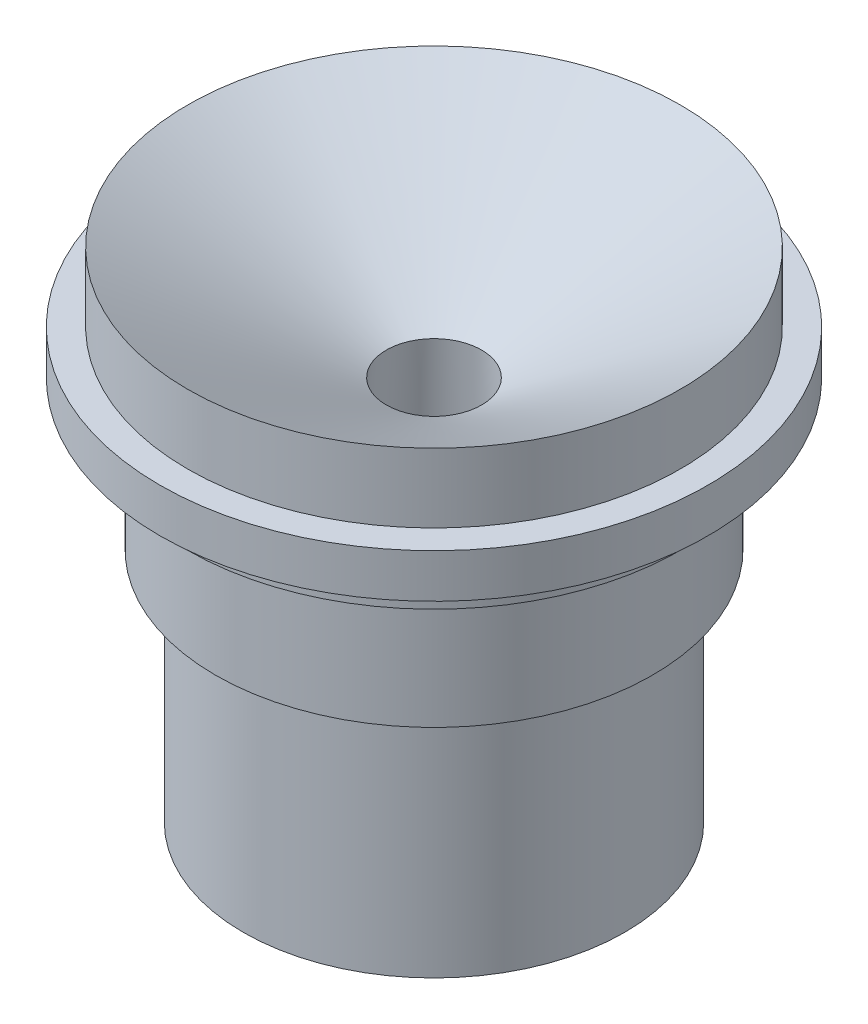
ISO-10303-21;
HEADER;
FILE_DESCRIPTION(('STEP AP214'),'2;1');
FILE_NAME('part.step','',(''),(''),'','','');
FILE_SCHEMA(('AUTOMOTIVE_DESIGN { 1 0 10303 214 1 1 1 1 }'));
ENDSEC;
DATA;
#1=APPLICATION_CONTEXT('core data for automotive mechanical design processes');
#2=APPLICATION_PROTOCOL_DEFINITION('international standard','automotive_design',2000,#1);
#3=PRODUCT_CONTEXT('',#1,'mechanical');
#4=PRODUCT('Part','Part','',(#3));
#5=PRODUCT_RELATED_PRODUCT_CATEGORY('part','',(#4));
#6=PRODUCT_DEFINITION_FORMATION('','',#4);
#7=PRODUCT_DEFINITION_CONTEXT('part definition',#1,'design');
#8=PRODUCT_DEFINITION('design','',#6,#7);
#9=PRODUCT_DEFINITION_SHAPE('','',#8);
#10=(LENGTH_UNIT() NAMED_UNIT(*) SI_UNIT(.MILLI.,.METRE.));
#11=(NAMED_UNIT(*) PLANE_ANGLE_UNIT() SI_UNIT($,.RADIAN.));
#12=(NAMED_UNIT(*) SI_UNIT($,.STERADIAN.) SOLID_ANGLE_UNIT());
#13=UNCERTAINTY_MEASURE_WITH_UNIT(LENGTH_MEASURE(1.E-05),#10,'distance_accuracy_value','');
#14=(GEOMETRIC_REPRESENTATION_CONTEXT(3) GLOBAL_UNCERTAINTY_ASSIGNED_CONTEXT((#13)) GLOBAL_UNIT_ASSIGNED_CONTEXT((#10,
#11,#12)) REPRESENTATION_CONTEXT('',''));
#15=CARTESIAN_POINT('',(0.,0.,0.));
#16=DIRECTION('',(0.,0.,1.));
#17=DIRECTION('',(1.,0.,0.));
#18=AXIS2_PLACEMENT_3D('',#15,#16,#17);
#19=CARTESIAN_POINT('',(0.,69.2545966925437,0.));
#20=DIRECTION('',(0.,1.,0.));
#21=DIRECTION('',(0.,0.,1.));
#22=AXIS2_PLACEMENT_3D('',#19,#20,#21);
#23=CONICAL_SURFACE('',#22,8.56625315211337,1.0539623590716);
#24=CARTESIAN_POINT('',(0.,89.5587412123213,0.));
#25=DIRECTION('',(0.,1.,0.));
#26=DIRECTION('',(0.,0.,1.));
#27=AXIS2_PLACEMENT_3D('',#24,#25,#26);
#28=CIRCLE('',#27,44.29);
#29=CARTESIAN_POINT('',(0.,89.5587412123212,44.29));
#30=VERTEX_POINT('',#29);
#31=EDGE_CURVE('E77',#30,#30,#28,.T.);
#32=CARTESIAN_POINT('',(0.,69.2545966925437,0.));
#33=DIRECTION('',(0.,1.,0.));
#34=DIRECTION('',(0.,0.,1.));
#35=AXIS2_PLACEMENT_3D('',#32,#33,#34);
#36=CIRCLE('',#35,8.56625315211337);
#37=CARTESIAN_POINT('',(0.,69.2545966925437,8.56625315211336));
#38=VERTEX_POINT('',#37);
#39=EDGE_CURVE('E10',#38,#38,#36,.T.);
#40=CARTESIAN_POINT('',(0.,89.5587412123212,44.29));
#41=CARTESIAN_POINT('',(0.,89.3472397069069,43.9178776370012));
#42=CARTESIAN_POINT('',(0.,89.1357382014926,43.5457552740023));
#43=CARTESIAN_POINT('',(0.,88.7127351906638,42.8015105480047));
#44=CARTESIAN_POINT('',(0.,88.5012336852495,42.4293881850059));
#45=CARTESIAN_POINT('',(0.,88.0782306744208,41.6851434590083));
#46=CARTESIAN_POINT('',(0.,87.8667291690064,41.3130210960094));
#47=CARTESIAN_POINT('',(0.,87.4437261581778,40.5687763700118));
#48=CARTESIAN_POINT('',(0.,87.2322246527634,40.196654007013));
#49=CARTESIAN_POINT('',(0.,86.8092216419347,39.4524092810153));
#50=CARTESIAN_POINT('',(0.,86.5977201365204,39.0802869180165));
#51=CARTESIAN_POINT('',(0.,86.1747171256917,38.3360421920189));
#52=CARTESIAN_POINT('',(0.,85.9632156202773,37.9639198290201));
#53=CARTESIAN_POINT('',(0.,85.5402126094486,37.2196751030224));
#54=CARTESIAN_POINT('',(0.,85.3287111040343,36.8475527400236));
#55=CARTESIAN_POINT('',(0.,84.9057080932056,36.103308014026));
#56=CARTESIAN_POINT('',(0.,84.6942065877912,35.7311856510271));
#57=CARTESIAN_POINT('',(0.,84.2712035769625,34.9869409250295));
#58=CARTESIAN_POINT('',(0.,84.0597020715482,34.6148185620307));
#59=CARTESIAN_POINT('',(0.,83.6366990607195,33.8705738360331));
#60=CARTESIAN_POINT('',(0.,83.4251975553051,33.4984514730342));
#61=CARTESIAN_POINT('',(0.,83.0021945444764,32.7542067470366));
#62=CARTESIAN_POINT('',(0.,82.7906930390621,32.3820843840378));
#63=CARTESIAN_POINT('',(0.,82.3676900282334,31.6378396580401));
#64=CARTESIAN_POINT('',(0.,82.156188522819,31.2657172950413));
#65=CARTESIAN_POINT('',(0.,81.7331855119903,30.5214725690437));
#66=CARTESIAN_POINT('',(0.,81.521684006576,30.1493502060449));
#67=CARTESIAN_POINT('',(0.,81.0986809957473,29.4051054800472));
#68=CARTESIAN_POINT('',(0.,80.8871794903329,29.0329831170484));
#69=CARTESIAN_POINT('',(0.,80.4641764795042,28.2887383910508));
#70=CARTESIAN_POINT('',(0.,80.2526749740899,27.916616028052));
#71=CARTESIAN_POINT('',(0.,79.8296719632612,27.1723713020543));
#72=CARTESIAN_POINT('',(0.,79.6181704578468,26.8002489390555));
#73=CARTESIAN_POINT('',(0.,79.1951674470181,26.0560042130579));
#74=CARTESIAN_POINT('',(0.,78.9836659416038,25.683881850059));
#75=CARTESIAN_POINT('',(0.,78.5606629307751,24.9396371240614));
#76=CARTESIAN_POINT('',(0.,78.3491614253607,24.5675147610626));
#77=CARTESIAN_POINT('',(0.,77.926158414532,23.8232700350649));
#78=CARTESIAN_POINT('',(0.,77.7146569091177,23.4511476720661));
#79=CARTESIAN_POINT('',(0.,77.291653898289,22.7069029460685));
#80=CARTESIAN_POINT('',(0.,77.0801523928747,22.3347805830697));
#81=CARTESIAN_POINT('',(0.,76.657149382046,21.590535857072));
#82=CARTESIAN_POINT('',(0.,76.4456478766316,21.2184134940732));
#83=CARTESIAN_POINT('',(0.,76.0226448658029,20.4741687680756));
#84=CARTESIAN_POINT('',(0.,75.8111433603886,20.1020464050768));
#85=CARTESIAN_POINT('',(0.,75.3881403495599,19.3578016790791));
#86=CARTESIAN_POINT('',(0.,75.1766388441455,18.9856793160803));
#87=CARTESIAN_POINT('',(0.,74.7536358333168,18.2414345900827));
#88=CARTESIAN_POINT('',(0.,74.5421343279025,17.8693122270838));
#89=CARTESIAN_POINT('',(0.,74.1191313170738,17.1250675010862));
#90=CARTESIAN_POINT('',(0.,73.9076298116594,16.7529451380874));
#91=CARTESIAN_POINT('',(0.,73.4846268008307,16.0087004120897));
#92=CARTESIAN_POINT('',(0.,73.2731252954164,15.6365780490909));
#93=CARTESIAN_POINT('',(0.,72.8501222845877,14.8923333230933));
#94=CARTESIAN_POINT('',(0.,72.6386207791733,14.5202109600945));
#95=CARTESIAN_POINT('',(0.,72.2156177683446,13.7759662340968));
#96=CARTESIAN_POINT('',(0.,72.0041162629303,13.403843871098));
#97=CARTESIAN_POINT('',(0.,71.5811132521016,12.6595991451004));
#98=CARTESIAN_POINT('',(0.,71.3696117466872,12.2874767821015));
#99=CARTESIAN_POINT('',(0.,70.9466087358585,11.5432320561039));
#100=CARTESIAN_POINT('',(0.,70.7351072304442,11.1711096931051));
#101=CARTESIAN_POINT('',(0.,70.3121042196155,10.4268649671075));
#102=CARTESIAN_POINT('',(0.,70.1006027142011,10.0547426041086));
#103=CARTESIAN_POINT('',(0.,69.6775997033724,9.310497878111));
#104=CARTESIAN_POINT('',(0.,69.4660981979581,8.93837551511218));
#105=CARTESIAN_POINT('',(0.,69.2545966925437,8.56625315211336));
#106=B_SPLINE_CURVE_WITH_KNOTS('',3,(#40,#41,#42,#43,#44,#45,#46,#47,#48,#49,#50,#51,#52,#53,
#54,#55,#56,#57,#58,#59,#60,#61,#62,#63,#64,#65,#66,#67,#68,#69,#70,#71,#72,#73,#74,#75,#76,#77,
#78,#79,#80,#81,#82,#83,#84,#85,#86,#87,#88,#89,#90,#91,#92,#93,#94,#95,#96,#97,#98,#99,#100,
#101,#102,#103,#104,#105),.UNSPECIFIED.,.F.,.F.,(4,2,2,2,2,2,2,2,2,2,2,2,2,2,2,2,2,2,2,2,2,2,2,
2,2,2,2,2,2,2,2,2,4),(0.,1.28408389855462,2.56816779710925,3.85225169566387,5.1363355942185,
6.42041949277312,7.70450339132775,8.98858728988238,10.272671188437,11.5567550869916,
12.8408389855463,14.1249228841009,15.4090067826555,16.6930906812101,17.9771745797648,
19.2612584783194,20.545342376874,21.8294262754286,23.1135101739833,24.3975940725379,
25.6816779710925,26.9657618696471,28.2498457682018,29.5339296667564,30.818013565311,
32.1020974638656,33.3861813624203,34.6702652609749,35.9543491595295,37.2384330580841,
38.5225169566388,39.8066008551934,41.090684753748),.UNSPECIFIED.);
#107=EDGE_CURVE('BSEAM37',#30,#38,#106,.T.);
#108=ORIENTED_EDGE('',*,*,#31,.T.);
#109=ORIENTED_EDGE('',*,*,#39,.F.);
#110=ORIENTED_EDGE('',*,*,#107,.T.);
#111=ORIENTED_EDGE('',*,*,#107,.F.);
#112=EDGE_LOOP('',(#108,#110,#109,#111));
#113=FACE_BOUND('',#112,.T.);
#114=ADVANCED_FACE('F37',(#113),#23,.F.);
#115=CARTESIAN_POINT('',(0.,69.2545966925437,0.));
#116=DIRECTION('',(0.,-1.,0.));
#117=DIRECTION('',(0.,0.,-1.));
#118=AXIS2_PLACEMENT_3D('',#115,#116,#117);
#119=CONICAL_SURFACE('',#118,8.56625315211337,0.0677929089302117);
#120=CARTESIAN_POINT('',(0.,0.,0.));
#121=DIRECTION('',(0.,1.,0.));
#122=DIRECTION('',(0.,0.,1.));
#123=AXIS2_PLACEMENT_3D('',#120,#121,#122);
#124=CIRCLE('',#123,13.2684294704469);
#125=CARTESIAN_POINT('',(0.,0.,13.2684294704469));
#126=VERTEX_POINT('',#125);
#127=EDGE_CURVE('E43',#126,#126,#124,.T.);
#128=ORIENTED_EDGE('',*,*,#127,.F.);
#129=EDGE_LOOP('',(#128));
#130=FACE_BOUND('',#129,.T.);
#131=ORIENTED_EDGE('',*,*,#39,.T.);
#132=EDGE_LOOP('',(#131));
#133=FACE_BOUND('',#132,.T.);
#134=ADVANCED_FACE('F139',(#130,#133),#119,.F.);
#135=CARTESIAN_POINT('',(0.,0.,0.));
#136=DIRECTION('',(0.,-1.,0.));
#137=DIRECTION('',(0.,0.,-1.));
#138=AXIS2_PLACEMENT_3D('',#135,#136,#137);
#139=PLANE('',#138);
#140=ORIENTED_EDGE('',*,*,#127,.T.);
#141=EDGE_LOOP('',(#140));
#142=FACE_BOUND('',#141,.T.);
#143=CARTESIAN_POINT('',(0.,0.,0.));
#144=DIRECTION('',(0.,1.,0.));
#145=DIRECTION('',(0.,0.,1.));
#146=AXIS2_PLACEMENT_3D('',#143,#144,#145);
#147=CIRCLE('',#146,34.29);
#148=CARTESIAN_POINT('',(0.,0.,34.29));
#149=VERTEX_POINT('',#148);
#150=EDGE_CURVE('E47',#149,#149,#147,.T.);
#151=ORIENTED_EDGE('',*,*,#150,.F.);
#152=EDGE_LOOP('',(#151));
#153=FACE_BOUND('',#152,.T.);
#154=ADVANCED_FACE('F134',(#142,#153),#139,.T.);
#155=CARTESIAN_POINT('',(0.,89.5587412123212,0.));
#156=DIRECTION('',(0.,1.,0.));
#157=DIRECTION('',(0.,0.,1.));
#158=AXIS2_PLACEMENT_3D('',#155,#156,#157);
#159=CYLINDRICAL_SURFACE('',#158,34.29);
#160=CARTESIAN_POINT('',(0.,42.545,0.));
#161=DIRECTION('',(0.,1.,0.));
#162=DIRECTION('',(0.,0.,1.));
#163=AXIS2_PLACEMENT_3D('',#160,#161,#162);
#164=CIRCLE('',#163,34.29);
#165=CARTESIAN_POINT('',(0.,42.545,34.29));
#166=VERTEX_POINT('',#165);
#167=EDGE_CURVE('E51',#166,#166,#164,.T.);
#168=ORIENTED_EDGE('',*,*,#167,.F.);
#169=EDGE_LOOP('',(#168));
#170=FACE_BOUND('',#169,.T.);
#171=ORIENTED_EDGE('',*,*,#150,.T.);
#172=EDGE_LOOP('',(#171));
#173=FACE_BOUND('',#172,.T.);
#174=ADVANCED_FACE('F128',(#170,#173),#159,.T.);
#175=CARTESIAN_POINT('',(0.,42.545,0.));
#176=DIRECTION('',(0.,1.,0.));
#177=DIRECTION('',(0.,0.,1.));
#178=AXIS2_PLACEMENT_3D('',#175,#176,#177);
#179=PLANE('',#178);
#180=CARTESIAN_POINT('',(0.,42.545,0.));
#181=DIRECTION('',(0.,1.,0.));
#182=DIRECTION('',(0.,0.,1.));
#183=AXIS2_PLACEMENT_3D('',#180,#181,#182);
#184=CIRCLE('',#183,39.29);
#185=CARTESIAN_POINT('',(0.,42.545,39.29));
#186=VERTEX_POINT('',#185);
#187=EDGE_CURVE('E56',#186,#186,#184,.T.);
#188=ORIENTED_EDGE('',*,*,#187,.F.);
#189=EDGE_LOOP('',(#188));
#190=FACE_BOUND('',#189,.T.);
#191=ORIENTED_EDGE('',*,*,#167,.T.);
#192=EDGE_LOOP('',(#191));
#193=FACE_BOUND('',#192,.T.);
#194=ADVANCED_FACE('F122',(#190,#193),#179,.F.);
#195=CARTESIAN_POINT('',(0.,89.5587412123212,0.));
#196=DIRECTION('',(0.,1.,0.));
#197=DIRECTION('',(0.,0.,1.));
#198=AXIS2_PLACEMENT_3D('',#195,#196,#197);
#199=CYLINDRICAL_SURFACE('',#198,39.29);
#200=CARTESIAN_POINT('',(0.,64.4864865943804,0.));
#201=DIRECTION('',(0.,1.,0.));
#202=DIRECTION('',(0.,0.,1.));
#203=AXIS2_PLACEMENT_3D('',#200,#201,#202);
#204=CIRCLE('',#203,39.29);
#205=CARTESIAN_POINT('',(0.,64.4864865943804,39.29));
#206=VERTEX_POINT('',#205);
#207=EDGE_CURVE('E59',#206,#206,#204,.T.);
#208=ORIENTED_EDGE('',*,*,#207,.F.);
#209=EDGE_LOOP('',(#208));
#210=FACE_BOUND('',#209,.T.);
#211=ORIENTED_EDGE('',*,*,#187,.T.);
#212=EDGE_LOOP('',(#211));
#213=FACE_BOUND('',#212,.T.);
#214=ADVANCED_FACE('F116',(#210,#213),#199,.T.);
#215=CARTESIAN_POINT('',(1.78985955485657E-13,64.4864865943804,0.));
#216=DIRECTION('',(0.,1.,0.));
#217=DIRECTION('',(0.,0.,1.));
#218=AXIS2_PLACEMENT_3D('',#215,#216,#217);
#219=PLANE('',#218);
#220=CARTESIAN_POINT('',(0.,64.4864865943804,0.));
#221=DIRECTION('',(0.,1.,0.));
#222=DIRECTION('',(0.,0.,1.));
#223=AXIS2_PLACEMENT_3D('',#220,#221,#222);
#224=CIRCLE('',#223,44.29);
#225=CARTESIAN_POINT('',(0.,64.4864865943804,44.29));
#226=VERTEX_POINT('',#225);
#227=EDGE_CURVE('E62',#226,#226,#224,.T.);
#228=ORIENTED_EDGE('',*,*,#227,.F.);
#229=EDGE_LOOP('',(#228));
#230=FACE_BOUND('',#229,.T.);
#231=ORIENTED_EDGE('',*,*,#207,.T.);
#232=EDGE_LOOP('',(#231));
#233=FACE_BOUND('',#232,.T.);
#234=ADVANCED_FACE('F110',(#230,#233),#219,.F.);
#235=CARTESIAN_POINT('',(0.,89.5587412123212,0.));
#236=DIRECTION('',(0.,1.,0.));
#237=DIRECTION('',(0.,0.,1.));
#238=AXIS2_PLACEMENT_3D('',#235,#236,#237);
#239=CYLINDRICAL_SURFACE('',#238,44.29);
#240=CARTESIAN_POINT('',(0.,69.2545966925438,0.));
#241=DIRECTION('',(0.,1.,0.));
#242=DIRECTION('',(0.,0.,1.));
#243=AXIS2_PLACEMENT_3D('',#240,#241,#242);
#244=CIRCLE('',#243,44.29);
#245=CARTESIAN_POINT('',(0.,69.2545966925438,44.29));
#246=VERTEX_POINT('',#245);
#247=EDGE_CURVE('E65',#246,#246,#244,.T.);
#248=ORIENTED_EDGE('',*,*,#247,.F.);
#249=EDGE_LOOP('',(#248));
#250=FACE_BOUND('',#249,.T.);
#251=ORIENTED_EDGE('',*,*,#227,.T.);
#252=EDGE_LOOP('',(#251));
#253=FACE_BOUND('',#252,.T.);
#254=ADVANCED_FACE('F104',(#250,#253),#239,.T.);
#255=CARTESIAN_POINT('',(3.84440239045958E-13,69.2545966925437,0.));
#256=DIRECTION('',(0.,1.,0.));
#257=DIRECTION('',(0.,0.,1.));
#258=AXIS2_PLACEMENT_3D('',#255,#256,#257);
#259=PLANE('',#258);
#260=CARTESIAN_POINT('',(0.,69.2545966925437,0.));
#261=DIRECTION('',(0.,1.,0.));
#262=DIRECTION('',(0.,0.,1.));
#263=AXIS2_PLACEMENT_3D('',#260,#261,#262);
#264=CIRCLE('',#263,49.29);
#265=CARTESIAN_POINT('',(0.,69.2545966925437,49.29));
#266=VERTEX_POINT('',#265);
#267=EDGE_CURVE('E68',#266,#266,#264,.T.);
#268=ORIENTED_EDGE('',*,*,#267,.F.);
#269=EDGE_LOOP('',(#268));
#270=FACE_BOUND('',#269,.T.);
#271=ORIENTED_EDGE('',*,*,#247,.T.);
#272=EDGE_LOOP('',(#271));
#273=FACE_BOUND('',#272,.T.);
#274=ADVANCED_FACE('F98',(#270,#273),#259,.F.);
#275=CARTESIAN_POINT('',(0.,89.5587412123212,0.));
#276=DIRECTION('',(0.,1.,0.));
#277=DIRECTION('',(0.,0.,1.));
#278=AXIS2_PLACEMENT_3D('',#275,#276,#277);
#279=CYLINDRICAL_SURFACE('',#278,49.29);
#280=CARTESIAN_POINT('',(0.,77.137624245635,0.));
#281=DIRECTION('',(0.,1.,0.));
#282=DIRECTION('',(0.,0.,1.));
#283=AXIS2_PLACEMENT_3D('',#280,#281,#282);
#284=CIRCLE('',#283,49.29);
#285=CARTESIAN_POINT('',(0.,77.137624245635,49.29));
#286=VERTEX_POINT('',#285);
#287=EDGE_CURVE('E71',#286,#286,#284,.T.);
#288=ORIENTED_EDGE('',*,*,#287,.F.);
#289=EDGE_LOOP('',(#288));
#290=FACE_BOUND('',#289,.T.);
#291=ORIENTED_EDGE('',*,*,#267,.T.);
#292=EDGE_LOOP('',(#291));
#293=FACE_BOUND('',#292,.T.);
#294=ADVANCED_FACE('F92',(#290,#293),#279,.T.);
#295=CARTESIAN_POINT('',(0.,77.137624245635,0.));
#296=DIRECTION('',(0.,-1.,0.));
#297=DIRECTION('',(0.,0.,-1.));
#298=AXIS2_PLACEMENT_3D('',#295,#296,#297);
#299=PLANE('',#298);
#300=CARTESIAN_POINT('',(0.,77.137624245635,0.));
#301=DIRECTION('',(0.,1.,0.));
#302=DIRECTION('',(0.,0.,1.));
#303=AXIS2_PLACEMENT_3D('',#300,#301,#302);
#304=CIRCLE('',#303,44.29);
#305=CARTESIAN_POINT('',(0.,77.137624245635,44.29));
#306=VERTEX_POINT('',#305);
#307=EDGE_CURVE('E74',#306,#306,#304,.T.);
#308=ORIENTED_EDGE('',*,*,#307,.F.);
#309=EDGE_LOOP('',(#308));
#310=FACE_BOUND('',#309,.T.);
#311=ORIENTED_EDGE('',*,*,#287,.T.);
#312=EDGE_LOOP('',(#311));
#313=FACE_BOUND('',#312,.T.);
#314=ADVANCED_FACE('F86',(#310,#313),#299,.F.);
#315=CARTESIAN_POINT('',(0.,89.5587412123212,0.));
#316=DIRECTION('',(0.,1.,0.));
#317=DIRECTION('',(0.,0.,1.));
#318=AXIS2_PLACEMENT_3D('',#315,#316,#317);
#319=CYLINDRICAL_SURFACE('',#318,44.29);
#320=ORIENTED_EDGE('',*,*,#31,.F.);
#321=EDGE_LOOP('',(#320));
#322=FACE_BOUND('',#321,.T.);
#323=ORIENTED_EDGE('',*,*,#307,.T.);
#324=EDGE_LOOP('',(#323));
#325=FACE_BOUND('',#324,.T.);
#326=ADVANCED_FACE('F83',(#322,#325),#319,.T.);
#327=CLOSED_SHELL('',(#114,#134,#154,#174,#194,#214,#234,#254,#274,#294,#314,#326));
#328=MANIFOLD_SOLID_BREP('B2',#327);
#329=ADVANCED_BREP_SHAPE_REPRESENTATION('',(#18,#328),#14);
#330=SHAPE_DEFINITION_REPRESENTATION(#9,#329);
ENDSEC;
END-ISO-10303-21;
